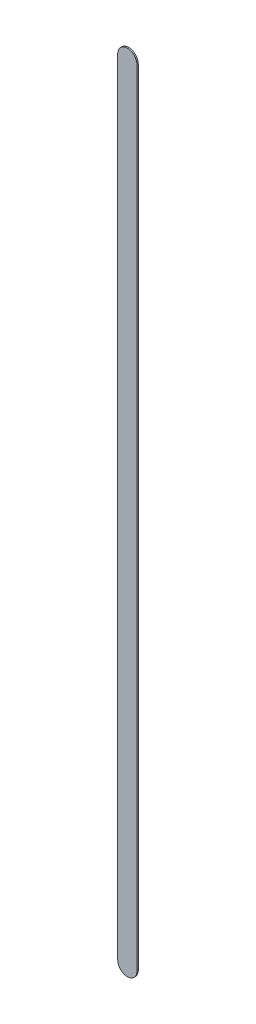
ISO-10303-21;
HEADER;
FILE_DESCRIPTION(('STEP AP214'),'2;1');
FILE_NAME('part.step','',(''),(''),'','','');
FILE_SCHEMA(('AUTOMOTIVE_DESIGN { 1 0 10303 214 1 1 1 1 }'));
ENDSEC;
DATA;
#1=APPLICATION_CONTEXT('core data for automotive mechanical design processes');
#2=APPLICATION_PROTOCOL_DEFINITION('international standard','automotive_design',2000,#1);
#3=PRODUCT_CONTEXT('',#1,'mechanical');
#4=PRODUCT('Part','Part','',(#3));
#5=PRODUCT_RELATED_PRODUCT_CATEGORY('part','',(#4));
#6=PRODUCT_DEFINITION_FORMATION('','',#4);
#7=PRODUCT_DEFINITION_CONTEXT('part definition',#1,'design');
#8=PRODUCT_DEFINITION('design','',#6,#7);
#9=PRODUCT_DEFINITION_SHAPE('','',#8);
#10=(LENGTH_UNIT() NAMED_UNIT(*) SI_UNIT(.MILLI.,.METRE.));
#11=(NAMED_UNIT(*) PLANE_ANGLE_UNIT() SI_UNIT($,.RADIAN.));
#12=(NAMED_UNIT(*) SI_UNIT($,.STERADIAN.) SOLID_ANGLE_UNIT());
#13=UNCERTAINTY_MEASURE_WITH_UNIT(LENGTH_MEASURE(1.E-05),#10,'distance_accuracy_value','');
#14=(GEOMETRIC_REPRESENTATION_CONTEXT(3) GLOBAL_UNCERTAINTY_ASSIGNED_CONTEXT((#13)) GLOBAL_UNIT_ASSIGNED_CONTEXT((#10,
#11,#12)) REPRESENTATION_CONTEXT('',''));
#15=CARTESIAN_POINT('',(0.,0.,0.));
#16=DIRECTION('',(0.,0.,1.));
#17=DIRECTION('',(1.,0.,0.));
#18=AXIS2_PLACEMENT_3D('',#15,#16,#17);
#19=CARTESIAN_POINT('',(52.15500364,74.99499606,0.));
#20=DIRECTION('',(-1.,0.,0.));
#21=DIRECTION('',(0.,1.,0.));
#22=AXIS2_PLACEMENT_3D('',#19,#20,#21);
#23=PLANE('',#22);
#24=DIRECTION('',(0.,1.,0.));
#25=VECTOR('',#24,1.);
#26=CARTESIAN_POINT('',(52.15500364,74.99499606,0.03556));
#27=LINE('',#26,#25);
#28=CARTESIAN_POINT('',(52.15500364,74.99499606,0.03556));
#29=VERTEX_POINT('',#28);
#30=CARTESIAN_POINT('',(52.15500364,95.45401026,0.03556));
#31=VERTEX_POINT('',#30);
#32=EDGE_CURVE('E11',#29,#31,#27,.T.);
#33=ORIENTED_EDGE('',*,*,#32,.F.);
#34=DIRECTION('',(0.,0.,1.));
#35=VECTOR('',#34,1.);
#36=CARTESIAN_POINT('',(52.15500364,74.99499606,0.));
#37=LINE('',#36,#35);
#38=CARTESIAN_POINT('',(52.15500364,74.99499606,0.));
#39=VERTEX_POINT('',#38);
#40=EDGE_CURVE('E24',#39,#29,#37,.T.);
#41=ORIENTED_EDGE('',*,*,#40,.F.);
#42=DIRECTION('',(0.,1.,0.));
#43=VECTOR('',#42,1.);
#44=CARTESIAN_POINT('',(52.15500364,74.99499606,0.));
#45=LINE('',#44,#43);
#46=CARTESIAN_POINT('',(52.15500364,95.45401026,0.));
#47=VERTEX_POINT('',#46);
#48=EDGE_CURVE('E75',#39,#47,#45,.T.);
#49=ORIENTED_EDGE('',*,*,#48,.T.);
#50=DIRECTION('',(0.,0.,1.));
#51=VECTOR('',#50,1.);
#52=CARTESIAN_POINT('',(52.15500364,95.45401026,0.));
#53=LINE('',#52,#51);
#54=EDGE_CURVE('E37',#47,#31,#53,.T.);
#55=ORIENTED_EDGE('',*,*,#54,.T.);
#56=EDGE_LOOP('',(#33,#41,#49,#55));
#57=FACE_BOUND('',#56,.T.);
#58=ADVANCED_FACE('F17',(#57),#23,.F.);
#59=CARTESIAN_POINT('',(51.90500414,95.45401026,0.));
#60=DIRECTION('',(0.,0.,-1.));
#61=DIRECTION('',(1.,0.,0.));
#62=AXIS2_PLACEMENT_3D('',#59,#60,#61);
#63=CYLINDRICAL_SURFACE('',#62,0.249999499999999);
#64=CARTESIAN_POINT('',(51.90500414,95.45401026,0.03556));
#65=DIRECTION('',(0.,0.,1.));
#66=DIRECTION('',(1.,0.,0.));
#67=AXIS2_PLACEMENT_3D('',#64,#65,#66);
#68=CIRCLE('',#67,0.249999499999999);
#69=CARTESIAN_POINT('',(51.65500464,95.45401026,0.03556));
#70=VERTEX_POINT('',#69);
#71=EDGE_CURVE('E83',#31,#70,#68,.T.);
#72=ORIENTED_EDGE('',*,*,#71,.F.);
#73=ORIENTED_EDGE('',*,*,#54,.F.);
#74=CARTESIAN_POINT('',(51.90500414,95.45401026,0.));
#75=DIRECTION('',(0.,0.,1.));
#76=DIRECTION('',(1.,0.,0.));
#77=AXIS2_PLACEMENT_3D('',#74,#75,#76);
#78=CIRCLE('',#77,0.249999499999999);
#79=CARTESIAN_POINT('',(51.65500464,95.45401026,0.));
#80=VERTEX_POINT('',#79);
#81=EDGE_CURVE('E81',#47,#80,#78,.T.);
#82=ORIENTED_EDGE('',*,*,#81,.T.);
#83=DIRECTION('',(0.,0.,1.));
#84=VECTOR('',#83,1.);
#85=CARTESIAN_POINT('',(51.65500464,95.45401026,0.));
#86=LINE('',#85,#84);
#87=EDGE_CURVE('E67',#80,#70,#86,.T.);
#88=ORIENTED_EDGE('',*,*,#87,.T.);
#89=EDGE_LOOP('',(#72,#73,#82,#88));
#90=FACE_BOUND('',#89,.T.);
#91=ADVANCED_FACE('F89',(#90),#63,.T.);
#92=CARTESIAN_POINT('',(51.65500464,95.45401026,0.));
#93=DIRECTION('',(1.,0.,0.));
#94=DIRECTION('',(0.,-1.,0.));
#95=AXIS2_PLACEMENT_3D('',#92,#93,#94);
#96=PLANE('',#95);
#97=DIRECTION('',(0.,-1.,0.));
#98=VECTOR('',#97,1.);
#99=CARTESIAN_POINT('',(51.65500464,95.45401026,0.03556));
#100=LINE('',#99,#98);
#101=CARTESIAN_POINT('',(51.65500464,74.99499606,0.03556));
#102=VERTEX_POINT('',#101);
#103=EDGE_CURVE('E71',#70,#102,#100,.T.);
#104=ORIENTED_EDGE('',*,*,#103,.F.);
#105=ORIENTED_EDGE('',*,*,#87,.F.);
#106=DIRECTION('',(0.,-1.,0.));
#107=VECTOR('',#106,1.);
#108=CARTESIAN_POINT('',(51.65500464,95.45401026,0.));
#109=LINE('',#108,#107);
#110=CARTESIAN_POINT('',(51.65500464,74.99499606,0.));
#111=VERTEX_POINT('',#110);
#112=EDGE_CURVE('E63',#80,#111,#109,.T.);
#113=ORIENTED_EDGE('',*,*,#112,.T.);
#114=DIRECTION('',(0.,0.,1.));
#115=VECTOR('',#114,1.);
#116=CARTESIAN_POINT('',(51.65500464,74.99499606,0.));
#117=LINE('',#116,#115);
#118=EDGE_CURVE('E53',#111,#102,#117,.T.);
#119=ORIENTED_EDGE('',*,*,#118,.T.);
#120=EDGE_LOOP('',(#104,#105,#113,#119));
#121=FACE_BOUND('',#120,.T.);
#122=ADVANCED_FACE('F66',(#121),#96,.F.);
#123=CARTESIAN_POINT('',(51.90500414,74.99499606,0.));
#124=DIRECTION('',(0.,0.,-1.));
#125=DIRECTION('',(-1.,0.,0.));
#126=AXIS2_PLACEMENT_3D('',#123,#124,#125);
#127=CYLINDRICAL_SURFACE('',#126,0.249999499999999);
#128=CARTESIAN_POINT('',(51.90500414,74.99499606,0.03556));
#129=DIRECTION('',(0.,0.,1.));
#130=DIRECTION('',(-1.,0.,0.));
#131=AXIS2_PLACEMENT_3D('',#128,#129,#130);
#132=CIRCLE('',#131,0.249999499999999);
#133=EDGE_CURVE('E59',#102,#29,#132,.T.);
#134=ORIENTED_EDGE('',*,*,#133,.F.);
#135=ORIENTED_EDGE('',*,*,#118,.F.);
#136=CARTESIAN_POINT('',(51.90500414,74.99499606,0.));
#137=DIRECTION('',(0.,0.,1.));
#138=DIRECTION('',(-1.,0.,0.));
#139=AXIS2_PLACEMENT_3D('',#136,#137,#138);
#140=CIRCLE('',#139,0.249999499999999);
#141=EDGE_CURVE('E57',#111,#39,#140,.T.);
#142=ORIENTED_EDGE('',*,*,#141,.T.);
#143=ORIENTED_EDGE('',*,*,#40,.T.);
#144=EDGE_LOOP('',(#134,#135,#142,#143));
#145=FACE_BOUND('',#144,.T.);
#146=ADVANCED_FACE('F55',(#145),#127,.T.);
#147=CARTESIAN_POINT('',(52.15500364,74.99499606,0.));
#148=DIRECTION('',(0.,0.,-1.));
#149=DIRECTION('',(-1.,0.,0.));
#150=AXIS2_PLACEMENT_3D('',#147,#148,#149);
#151=PLANE('',#150);
#152=ORIENTED_EDGE('',*,*,#141,.F.);
#153=ORIENTED_EDGE('',*,*,#112,.F.);
#154=ORIENTED_EDGE('',*,*,#81,.F.);
#155=ORIENTED_EDGE('',*,*,#48,.F.);
#156=EDGE_LOOP('',(#152,#153,#154,#155));
#157=FACE_BOUND('',#156,.T.);
#158=ADVANCED_FACE('F74',(#157),#151,.T.);
#159=CARTESIAN_POINT('',(52.15500364,74.99499606,0.03556));
#160=DIRECTION('',(0.,0.,-1.));
#161=DIRECTION('',(-1.,0.,0.));
#162=AXIS2_PLACEMENT_3D('',#159,#160,#161);
#163=PLANE('',#162);
#164=ORIENTED_EDGE('',*,*,#32,.T.);
#165=ORIENTED_EDGE('',*,*,#71,.T.);
#166=ORIENTED_EDGE('',*,*,#103,.T.);
#167=ORIENTED_EDGE('',*,*,#133,.T.);
#168=EDGE_LOOP('',(#164,#165,#166,#167));
#169=FACE_BOUND('',#168,.T.);
#170=ADVANCED_FACE('F91',(#169),#163,.F.);
#171=CLOSED_SHELL('',(#58,#91,#122,#146,#158,#170));
#172=MANIFOLD_SOLID_BREP('B1',#171);
#173=ADVANCED_BREP_SHAPE_REPRESENTATION('',(#18,#172),#14);
#174=SHAPE_DEFINITION_REPRESENTATION(#9,#173);
ENDSEC;
END-ISO-10303-21;
